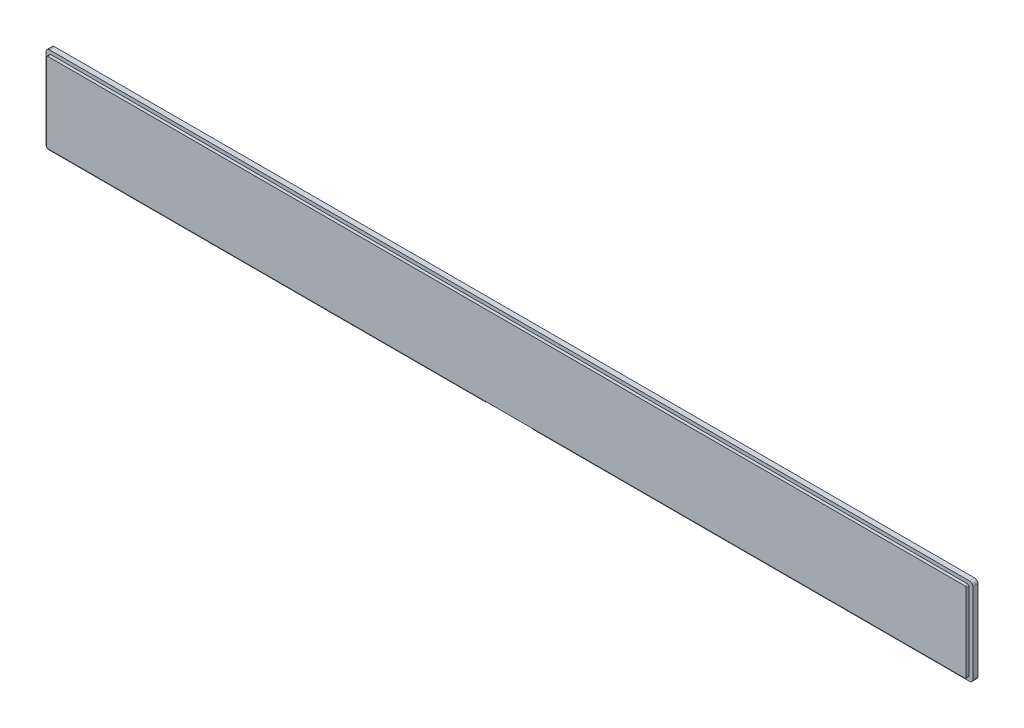
ISO-10303-21;
HEADER;
FILE_DESCRIPTION(('STEP AP214'),'2;1');
FILE_NAME('part.step','',(''),(''),'','','');
FILE_SCHEMA(('AUTOMOTIVE_DESIGN { 1 0 10303 214 1 1 1 1 }'));
ENDSEC;
DATA;
#1=APPLICATION_CONTEXT('core data for automotive mechanical design processes');
#2=APPLICATION_PROTOCOL_DEFINITION('international standard','automotive_design',2000,#1);
#3=PRODUCT_CONTEXT('',#1,'mechanical');
#4=PRODUCT('Part','Part','',(#3));
#5=PRODUCT_RELATED_PRODUCT_CATEGORY('part','',(#4));
#6=PRODUCT_DEFINITION_FORMATION('','',#4);
#7=PRODUCT_DEFINITION_CONTEXT('part definition',#1,'design');
#8=PRODUCT_DEFINITION('design','',#6,#7);
#9=PRODUCT_DEFINITION_SHAPE('','',#8);
#10=(LENGTH_UNIT() NAMED_UNIT(*) SI_UNIT(.MILLI.,.METRE.));
#11=(NAMED_UNIT(*) PLANE_ANGLE_UNIT() SI_UNIT($,.RADIAN.));
#12=(NAMED_UNIT(*) SI_UNIT($,.STERADIAN.) SOLID_ANGLE_UNIT());
#13=UNCERTAINTY_MEASURE_WITH_UNIT(LENGTH_MEASURE(1.E-05),#10,'distance_accuracy_value','');
#14=(GEOMETRIC_REPRESENTATION_CONTEXT(3) GLOBAL_UNCERTAINTY_ASSIGNED_CONTEXT((#13)) GLOBAL_UNIT_ASSIGNED_CONTEXT((#10,
#11,#12)) REPRESENTATION_CONTEXT('',''));
#15=CARTESIAN_POINT('',(0.,0.,0.));
#16=DIRECTION('',(0.,0.,1.));
#17=DIRECTION('',(1.,0.,0.));
#18=AXIS2_PLACEMENT_3D('',#15,#16,#17);
#19=CARTESIAN_POINT('',(213.25,-20.,2.4));
#20=DIRECTION('',(0.,1.,0.));
#21=DIRECTION('',(-1.,0.,0.));
#22=AXIS2_PLACEMENT_3D('',#19,#20,#21);
#23=PLANE('',#22);
#24=DIRECTION('',(0.,0.,1.));
#25=VECTOR('',#24,1.);
#26=CARTESIAN_POINT('',(-11.,-20.,0.));
#27=LINE('',#26,#25);
#28=CARTESIAN_POINT('',(-11.,-20.,0.));
#29=VERTEX_POINT('',#28);
#30=CARTESIAN_POINT('',(-11.,-20.,2.4));
#31=VERTEX_POINT('',#30);
#32=EDGE_CURVE('E171',#29,#31,#27,.T.);
#33=ORIENTED_EDGE('',*,*,#32,.T.);
#34=DIRECTION('',(1.,0.,0.));
#35=VECTOR('',#34,1.);
#36=CARTESIAN_POINT('',(213.25,-20.,2.4));
#37=LINE('',#36,#35);
#38=CARTESIAN_POINT('',(-211.75,-20.,2.4));
#39=VERTEX_POINT('',#38);
#40=EDGE_CURVE('E325',#39,#31,#37,.T.);
#41=ORIENTED_EDGE('',*,*,#40,.F.);
#42=DIRECTION('',(0.,0.,-1.));
#43=VECTOR('',#42,1.);
#44=CARTESIAN_POINT('',(-211.75,-20.,2.4));
#45=LINE('',#44,#43);
#46=CARTESIAN_POINT('',(-211.75,-20.,0.));
#47=VERTEX_POINT('',#46);
#48=EDGE_CURVE('E195',#39,#47,#45,.T.);
#49=ORIENTED_EDGE('',*,*,#48,.T.);
#50=DIRECTION('',(1.,0.,0.));
#51=VECTOR('',#50,1.);
#52=CARTESIAN_POINT('',(213.25,-20.,0.));
#53=LINE('',#52,#51);
#54=EDGE_CURVE('E187',#47,#29,#53,.T.);
#55=ORIENTED_EDGE('',*,*,#54,.T.);
#56=EDGE_LOOP('',(#33,#41,#49,#55));
#57=FACE_BOUND('',#56,.T.);
#58=ADVANCED_FACE('F37',(#57),#23,.F.);
#59=CARTESIAN_POINT('',(0.,0.,2.4));
#60=DIRECTION('',(0.,0.,1.));
#61=DIRECTION('',(1.,0.,0.));
#62=AXIS2_PLACEMENT_3D('',#59,#60,#61);
#63=PLANE('',#62);
#64=CARTESIAN_POINT('',(11.,-19.,2.4));
#65=DIRECTION('',(0.,0.,-1.));
#66=DIRECTION('',(-1.,0.,0.));
#67=AXIS2_PLACEMENT_3D('',#64,#65,#66);
#68=CIRCLE('',#67,0.999999999999987);
#69=CARTESIAN_POINT('',(11.,-20.,2.4));
#70=VERTEX_POINT('',#69);
#71=CARTESIAN_POINT('',(10.,-19.,2.4));
#72=VERTEX_POINT('',#71);
#73=EDGE_CURVE('E354',#70,#72,#68,.T.);
#74=ORIENTED_EDGE('',*,*,#73,.F.);
#75=CARTESIAN_POINT('',(211.75,-20.,2.4));
#76=VERTEX_POINT('',#75);
#77=EDGE_CURVE('E324',#70,#76,#37,.T.);
#78=ORIENTED_EDGE('',*,*,#77,.T.);
#79=CARTESIAN_POINT('',(211.75,-18.5,2.4));
#80=DIRECTION('',(0.,0.,1.));
#81=DIRECTION('',(1.,0.,0.));
#82=AXIS2_PLACEMENT_3D('',#79,#80,#81);
#83=CIRCLE('',#82,1.5);
#84=CARTESIAN_POINT('',(213.25,-18.5,2.4));
#85=VERTEX_POINT('',#84);
#86=EDGE_CURVE('E230',#76,#85,#83,.T.);
#87=ORIENTED_EDGE('',*,*,#86,.T.);
#88=DIRECTION('',(0.,1.,0.));
#89=VECTOR('',#88,1.);
#90=CARTESIAN_POINT('',(213.25,-20.,2.4));
#91=LINE('',#90,#89);
#92=CARTESIAN_POINT('',(213.25,18.5,2.4));
#93=VERTEX_POINT('',#92);
#94=EDGE_CURVE('E327',#85,#93,#91,.T.);
#95=ORIENTED_EDGE('',*,*,#94,.T.);
#96=CARTESIAN_POINT('',(211.75,18.5,2.4));
#97=DIRECTION('',(0.,0.,1.));
#98=DIRECTION('',(1.,0.,0.));
#99=AXIS2_PLACEMENT_3D('',#96,#97,#98);
#100=CIRCLE('',#99,1.5);
#101=CARTESIAN_POINT('',(211.75,20.,2.4));
#102=VERTEX_POINT('',#101);
#103=EDGE_CURVE('E228',#93,#102,#100,.T.);
#104=ORIENTED_EDGE('',*,*,#103,.T.);
#105=DIRECTION('',(-1.,0.,0.));
#106=VECTOR('',#105,1.);
#107=CARTESIAN_POINT('',(213.25,20.,2.4));
#108=LINE('',#107,#106);
#109=CARTESIAN_POINT('',(-211.75,20.,2.4));
#110=VERTEX_POINT('',#109);
#111=EDGE_CURVE('E212',#102,#110,#108,.T.);
#112=ORIENTED_EDGE('',*,*,#111,.T.);
#113=CARTESIAN_POINT('',(-211.75,18.5,2.4));
#114=DIRECTION('',(0.,0.,1.));
#115=DIRECTION('',(1.,0.,0.));
#116=AXIS2_PLACEMENT_3D('',#113,#114,#115);
#117=CIRCLE('',#116,1.5);
#118=CARTESIAN_POINT('',(-213.25,18.5,2.4));
#119=VERTEX_POINT('',#118);
#120=EDGE_CURVE('E232',#110,#119,#117,.T.);
#121=ORIENTED_EDGE('',*,*,#120,.T.);
#122=DIRECTION('',(0.,-1.,0.));
#123=VECTOR('',#122,1.);
#124=CARTESIAN_POINT('',(-213.25,-20.,2.4));
#125=LINE('',#124,#123);
#126=CARTESIAN_POINT('',(-213.25,-18.5,2.4));
#127=VERTEX_POINT('',#126);
#128=EDGE_CURVE('E208',#119,#127,#125,.T.);
#129=ORIENTED_EDGE('',*,*,#128,.T.);
#130=CARTESIAN_POINT('',(-211.75,-18.5,2.4));
#131=DIRECTION('',(0.,0.,1.));
#132=DIRECTION('',(1.,0.,0.));
#133=AXIS2_PLACEMENT_3D('',#130,#131,#132);
#134=CIRCLE('',#133,1.5);
#135=EDGE_CURVE('E234',#127,#39,#134,.T.);
#136=ORIENTED_EDGE('',*,*,#135,.T.);
#137=ORIENTED_EDGE('',*,*,#40,.T.);
#138=CARTESIAN_POINT('',(-11.,-19.,2.4));
#139=DIRECTION('',(0.,0.,-1.));
#140=DIRECTION('',(1.,0.,0.));
#141=AXIS2_PLACEMENT_3D('',#138,#139,#140);
#142=CIRCLE('',#141,0.999999999999987);
#143=CARTESIAN_POINT('',(-10.,-19.,2.4));
#144=VERTEX_POINT('',#143);
#145=EDGE_CURVE('E174',#144,#31,#142,.T.);
#146=ORIENTED_EDGE('',*,*,#145,.F.);
#147=DIRECTION('',(-1.,0.,0.));
#148=VECTOR('',#147,1.);
#149=CARTESIAN_POINT('',(0.,-19.,2.4));
#150=LINE('',#149,#148);
#151=EDGE_CURVE('E353',#72,#144,#150,.T.);
#152=ORIENTED_EDGE('',*,*,#151,.F.);
#153=EDGE_LOOP('',(#74,#78,#87,#95,#104,#112,#121,#129,#136,#137,#146,#152));
#154=FACE_BOUND('',#153,.T.);
#155=DIRECTION('',(-1.,0.,0.));
#156=VECTOR('',#155,1.);
#157=CARTESIAN_POINT('',(-211.6,18.4,2.4));
#158=LINE('',#157,#156);
#159=CARTESIAN_POINT('',(211.1,18.4,2.4));
#160=VERTEX_POINT('',#159);
#161=CARTESIAN_POINT('',(-211.1,18.4,2.4));
#162=VERTEX_POINT('',#161);
#163=EDGE_CURVE('E317',#160,#162,#158,.T.);
#164=ORIENTED_EDGE('',*,*,#163,.F.);
#165=CARTESIAN_POINT('',(211.1,17.9,2.4));
#166=DIRECTION('',(0.,0.,1.));
#167=DIRECTION('',(1.,0.,0.));
#168=AXIS2_PLACEMENT_3D('',#165,#166,#167);
#169=CIRCLE('',#168,0.5);
#170=CARTESIAN_POINT('',(211.6,17.9,2.4));
#171=VERTEX_POINT('',#170);
#172=EDGE_CURVE('E274',#160,#171,#169,.F.);
#173=ORIENTED_EDGE('',*,*,#172,.T.);
#174=DIRECTION('',(0.,1.,0.));
#175=VECTOR('',#174,1.);
#176=CARTESIAN_POINT('',(211.6,18.4,2.4));
#177=LINE('',#176,#175);
#178=CARTESIAN_POINT('',(211.6,-17.9,2.4));
#179=VERTEX_POINT('',#178);
#180=EDGE_CURVE('E283',#179,#171,#177,.T.);
#181=ORIENTED_EDGE('',*,*,#180,.F.);
#182=CARTESIAN_POINT('',(211.1,-17.9,2.4));
#183=DIRECTION('',(0.,0.,1.));
#184=DIRECTION('',(1.,0.,0.));
#185=AXIS2_PLACEMENT_3D('',#182,#183,#184);
#186=CIRCLE('',#185,0.5);
#187=CARTESIAN_POINT('',(211.1,-18.4,2.4));
#188=VERTEX_POINT('',#187);
#189=EDGE_CURVE('E276',#179,#188,#186,.F.);
#190=ORIENTED_EDGE('',*,*,#189,.T.);
#191=DIRECTION('',(1.,0.,0.));
#192=VECTOR('',#191,1.);
#193=CARTESIAN_POINT('',(-211.6,-18.4,2.4));
#194=LINE('',#193,#192);
#195=CARTESIAN_POINT('',(-211.1,-18.4,2.4));
#196=VERTEX_POINT('',#195);
#197=EDGE_CURVE('E281',#196,#188,#194,.T.);
#198=ORIENTED_EDGE('',*,*,#197,.F.);
#199=CARTESIAN_POINT('',(-211.1,-17.9,2.4));
#200=DIRECTION('',(0.,0.,1.));
#201=DIRECTION('',(1.,0.,0.));
#202=AXIS2_PLACEMENT_3D('',#199,#200,#201);
#203=CIRCLE('',#202,0.5);
#204=CARTESIAN_POINT('',(-211.6,-17.9,2.4));
#205=VERTEX_POINT('',#204);
#206=EDGE_CURVE('E45',#196,#205,#203,.F.);
#207=ORIENTED_EDGE('',*,*,#206,.T.);
#208=DIRECTION('',(0.,-1.,0.));
#209=VECTOR('',#208,1.);
#210=CARTESIAN_POINT('',(-211.6,18.4,2.4));
#211=LINE('',#210,#209);
#212=CARTESIAN_POINT('',(-211.6,17.9,2.4));
#213=VERTEX_POINT('',#212);
#214=EDGE_CURVE('E293',#213,#205,#211,.T.);
#215=ORIENTED_EDGE('',*,*,#214,.F.);
#216=CARTESIAN_POINT('',(-211.1,17.9,2.4));
#217=DIRECTION('',(0.,0.,1.));
#218=DIRECTION('',(1.,0.,0.));
#219=AXIS2_PLACEMENT_3D('',#216,#217,#218);
#220=CIRCLE('',#219,0.5);
#221=EDGE_CURVE('E11',#213,#162,#220,.F.);
#222=ORIENTED_EDGE('',*,*,#221,.T.);
#223=EDGE_LOOP('',(#164,#173,#181,#190,#198,#207,#215,#222));
#224=FACE_BOUND('',#223,.T.);
#225=ADVANCED_FACE('F280',(#154,#224),#63,.T.);
#226=CARTESIAN_POINT('',(-213.25,-20.,2.4));
#227=DIRECTION('',(1.,0.,0.));
#228=DIRECTION('',(0.,0.,-1.));
#229=AXIS2_PLACEMENT_3D('',#226,#227,#228);
#230=PLANE('',#229);
#231=DIRECTION('',(0.,-1.,0.));
#232=VECTOR('',#231,1.);
#233=CARTESIAN_POINT('',(-213.25,-20.,0.));
#234=LINE('',#233,#232);
#235=CARTESIAN_POINT('',(-213.25,18.5,0.));
#236=VERTEX_POINT('',#235);
#237=CARTESIAN_POINT('',(-213.25,-18.5,0.));
#238=VERTEX_POINT('',#237);
#239=EDGE_CURVE('E202',#236,#238,#234,.T.);
#240=ORIENTED_EDGE('',*,*,#239,.T.);
#241=DIRECTION('',(0.,0.,-1.));
#242=VECTOR('',#241,1.);
#243=CARTESIAN_POINT('',(-213.25,-18.5,2.4));
#244=LINE('',#243,#242);
#245=EDGE_CURVE('E226',#238,#127,#244,.F.);
#246=ORIENTED_EDGE('',*,*,#245,.T.);
#247=ORIENTED_EDGE('',*,*,#128,.F.);
#248=DIRECTION('',(0.,0.,-1.));
#249=VECTOR('',#248,1.);
#250=CARTESIAN_POINT('',(-213.25,18.5,2.4));
#251=LINE('',#250,#249);
#252=EDGE_CURVE('E223',#119,#236,#251,.T.);
#253=ORIENTED_EDGE('',*,*,#252,.T.);
#254=EDGE_LOOP('',(#240,#246,#247,#253));
#255=FACE_BOUND('',#254,.T.);
#256=ADVANCED_FACE('F345',(#255),#230,.F.);
#257=ORIENTED_EDGE('',*,*,#77,.F.);
#258=DIRECTION('',(0.,0.,1.));
#259=VECTOR('',#258,1.);
#260=CARTESIAN_POINT('',(11.,-20.,0.));
#261=LINE('',#260,#259);
#262=CARTESIAN_POINT('',(11.,-20.,0.));
#263=VERTEX_POINT('',#262);
#264=EDGE_CURVE('E179',#263,#70,#261,.T.);
#265=ORIENTED_EDGE('',*,*,#264,.F.);
#266=CARTESIAN_POINT('',(211.75,-20.,0.));
#267=VERTEX_POINT('',#266);
#268=EDGE_CURVE('E197',#263,#267,#53,.T.);
#269=ORIENTED_EDGE('',*,*,#268,.T.);
#270=DIRECTION('',(0.,0.,-1.));
#271=VECTOR('',#270,1.);
#272=CARTESIAN_POINT('',(211.75,-20.,2.4));
#273=LINE('',#272,#271);
#274=EDGE_CURVE('E209',#267,#76,#273,.F.);
#275=ORIENTED_EDGE('',*,*,#274,.T.);
#276=EDGE_LOOP('',(#257,#265,#269,#275));
#277=FACE_BOUND('',#276,.T.);
#278=ADVANCED_FACE('F367',(#277),#23,.F.);
#279=CARTESIAN_POINT('',(213.25,-20.,2.4));
#280=DIRECTION('',(-1.,0.,0.));
#281=DIRECTION('',(0.,0.,1.));
#282=AXIS2_PLACEMENT_3D('',#279,#280,#281);
#283=PLANE('',#282);
#284=ORIENTED_EDGE('',*,*,#94,.F.);
#285=DIRECTION('',(0.,0.,-1.));
#286=VECTOR('',#285,1.);
#287=CARTESIAN_POINT('',(213.25,-18.5,2.4));
#288=LINE('',#287,#286);
#289=CARTESIAN_POINT('',(213.25,-18.5,0.));
#290=VERTEX_POINT('',#289);
#291=EDGE_CURVE('E243',#85,#290,#288,.T.);
#292=ORIENTED_EDGE('',*,*,#291,.T.);
#293=DIRECTION('',(0.,1.,0.));
#294=VECTOR('',#293,1.);
#295=CARTESIAN_POINT('',(213.25,-20.,0.));
#296=LINE('',#295,#294);
#297=CARTESIAN_POINT('',(213.25,18.5,0.));
#298=VERTEX_POINT('',#297);
#299=EDGE_CURVE('E196',#290,#298,#296,.T.);
#300=ORIENTED_EDGE('',*,*,#299,.T.);
#301=DIRECTION('',(0.,0.,-1.));
#302=VECTOR('',#301,1.);
#303=CARTESIAN_POINT('',(213.25,18.5,2.4));
#304=LINE('',#303,#302);
#305=EDGE_CURVE('E241',#298,#93,#304,.F.);
#306=ORIENTED_EDGE('',*,*,#305,.T.);
#307=EDGE_LOOP('',(#284,#292,#300,#306));
#308=FACE_BOUND('',#307,.T.);
#309=ADVANCED_FACE('F375',(#308),#283,.F.);
#310=CARTESIAN_POINT('',(213.25,20.,2.4));
#311=DIRECTION('',(0.,-1.,0.));
#312=DIRECTION('',(1.,0.,0.));
#313=AXIS2_PLACEMENT_3D('',#310,#311,#312);
#314=PLANE('',#313);
#315=DIRECTION('',(-1.,0.,0.));
#316=VECTOR('',#315,1.);
#317=CARTESIAN_POINT('',(213.25,20.,0.));
#318=LINE('',#317,#316);
#319=CARTESIAN_POINT('',(211.75,20.,0.));
#320=VERTEX_POINT('',#319);
#321=CARTESIAN_POINT('',(-211.75,20.,0.));
#322=VERTEX_POINT('',#321);
#323=EDGE_CURVE('E200',#320,#322,#318,.T.);
#324=ORIENTED_EDGE('',*,*,#323,.T.);
#325=DIRECTION('',(0.,0.,-1.));
#326=VECTOR('',#325,1.);
#327=CARTESIAN_POINT('',(-211.75,20.,2.4));
#328=LINE('',#327,#326);
#329=EDGE_CURVE('E239',#322,#110,#328,.F.);
#330=ORIENTED_EDGE('',*,*,#329,.T.);
#331=ORIENTED_EDGE('',*,*,#111,.F.);
#332=DIRECTION('',(0.,0.,-1.));
#333=VECTOR('',#332,1.);
#334=CARTESIAN_POINT('',(211.75,20.,2.4));
#335=LINE('',#334,#333);
#336=EDGE_CURVE('E236',#102,#320,#335,.T.);
#337=ORIENTED_EDGE('',*,*,#336,.T.);
#338=EDGE_LOOP('',(#324,#330,#331,#337));
#339=FACE_BOUND('',#338,.T.);
#340=ADVANCED_FACE('F380',(#339),#314,.F.);
#341=CARTESIAN_POINT('',(0.,0.,0.));
#342=DIRECTION('',(0.,0.,1.));
#343=DIRECTION('',(1.,0.,0.));
#344=AXIS2_PLACEMENT_3D('',#341,#342,#343);
#345=PLANE('',#344);
#346=ORIENTED_EDGE('',*,*,#268,.F.);
#347=CARTESIAN_POINT('',(11.,-19.,0.));
#348=DIRECTION('',(0.,0.,-1.));
#349=DIRECTION('',(-1.,0.,0.));
#350=AXIS2_PLACEMENT_3D('',#347,#348,#349);
#351=CIRCLE('',#350,0.999999999999987);
#352=CARTESIAN_POINT('',(10.,-19.,0.));
#353=VERTEX_POINT('',#352);
#354=EDGE_CURVE('E191',#263,#353,#351,.T.);
#355=ORIENTED_EDGE('',*,*,#354,.T.);
#356=DIRECTION('',(-1.,0.,0.));
#357=VECTOR('',#356,1.);
#358=CARTESIAN_POINT('',(0.,-19.,0.));
#359=LINE('',#358,#357);
#360=CARTESIAN_POINT('',(-10.,-19.,0.));
#361=VERTEX_POINT('',#360);
#362=EDGE_CURVE('E190',#353,#361,#359,.T.);
#363=ORIENTED_EDGE('',*,*,#362,.T.);
#364=CARTESIAN_POINT('',(-11.,-19.,0.));
#365=DIRECTION('',(0.,0.,-1.));
#366=DIRECTION('',(1.,0.,0.));
#367=AXIS2_PLACEMENT_3D('',#364,#365,#366);
#368=CIRCLE('',#367,0.999999999999987);
#369=EDGE_CURVE('E52',#361,#29,#368,.T.);
#370=ORIENTED_EDGE('',*,*,#369,.T.);
#371=ORIENTED_EDGE('',*,*,#54,.F.);
#372=CARTESIAN_POINT('',(-211.75,-18.5,0.));
#373=DIRECTION('',(0.,0.,1.));
#374=DIRECTION('',(1.,0.,0.));
#375=AXIS2_PLACEMENT_3D('',#372,#373,#374);
#376=CIRCLE('',#375,1.5);
#377=EDGE_CURVE('E221',#47,#238,#376,.F.);
#378=ORIENTED_EDGE('',*,*,#377,.T.);
#379=ORIENTED_EDGE('',*,*,#239,.F.);
#380=CARTESIAN_POINT('',(-211.75,18.5,0.));
#381=DIRECTION('',(0.,0.,1.));
#382=DIRECTION('',(1.,0.,0.));
#383=AXIS2_PLACEMENT_3D('',#380,#381,#382);
#384=CIRCLE('',#383,1.5);
#385=EDGE_CURVE('E219',#236,#322,#384,.F.);
#386=ORIENTED_EDGE('',*,*,#385,.T.);
#387=ORIENTED_EDGE('',*,*,#323,.F.);
#388=CARTESIAN_POINT('',(211.75,18.5,0.));
#389=DIRECTION('',(0.,0.,1.));
#390=DIRECTION('',(1.,0.,0.));
#391=AXIS2_PLACEMENT_3D('',#388,#389,#390);
#392=CIRCLE('',#391,1.5);
#393=EDGE_CURVE('E214',#320,#298,#392,.F.);
#394=ORIENTED_EDGE('',*,*,#393,.T.);
#395=ORIENTED_EDGE('',*,*,#299,.F.);
#396=CARTESIAN_POINT('',(211.75,-18.5,0.));
#397=DIRECTION('',(0.,0.,1.));
#398=DIRECTION('',(1.,0.,0.));
#399=AXIS2_PLACEMENT_3D('',#396,#397,#398);
#400=CIRCLE('',#399,1.5);
#401=EDGE_CURVE('E216',#290,#267,#400,.F.);
#402=ORIENTED_EDGE('',*,*,#401,.T.);
#403=EDGE_LOOP('',(#346,#355,#363,#370,#371,#378,#379,#386,#387,#394,#395,#402));
#404=FACE_BOUND('',#403,.T.);
#405=ADVANCED_FACE('F186',(#404),#345,.F.);
#406=CARTESIAN_POINT('',(211.6,18.4,3.8));
#407=DIRECTION('',(-1.,0.,0.));
#408=DIRECTION('',(0.,0.,1.));
#409=AXIS2_PLACEMENT_3D('',#406,#407,#408);
#410=PLANE('',#409);
#411=ORIENTED_EDGE('',*,*,#180,.T.);
#412=DIRECTION('',(0.,0.,-1.));
#413=VECTOR('',#412,1.);
#414=CARTESIAN_POINT('',(211.6,17.9,3.8));
#415=LINE('',#414,#413);
#416=CARTESIAN_POINT('',(211.6,17.9,3.8));
#417=VERTEX_POINT('',#416);
#418=EDGE_CURVE('E254',#171,#417,#415,.F.);
#419=ORIENTED_EDGE('',*,*,#418,.T.);
#420=DIRECTION('',(0.,1.,0.));
#421=VECTOR('',#420,1.);
#422=CARTESIAN_POINT('',(211.6,18.4,3.8));
#423=LINE('',#422,#421);
#424=CARTESIAN_POINT('',(211.6,-17.9,3.8));
#425=VERTEX_POINT('',#424);
#426=EDGE_CURVE('E292',#425,#417,#423,.T.);
#427=ORIENTED_EDGE('',*,*,#426,.F.);
#428=DIRECTION('',(0.,0.,-1.));
#429=VECTOR('',#428,1.);
#430=CARTESIAN_POINT('',(211.6,-17.9,3.8));
#431=LINE('',#430,#429);
#432=EDGE_CURVE('E251',#425,#179,#431,.T.);
#433=ORIENTED_EDGE('',*,*,#432,.T.);
#434=EDGE_LOOP('',(#411,#419,#427,#433));
#435=FACE_BOUND('',#434,.T.);
#436=ADVANCED_FACE('F304',(#435),#410,.F.);
#437=CARTESIAN_POINT('',(-211.6,18.4,3.8));
#438=DIRECTION('',(0.,-1.,0.));
#439=DIRECTION('',(0.,0.,-1.));
#440=AXIS2_PLACEMENT_3D('',#437,#438,#439);
#441=PLANE('',#440);
#442=DIRECTION('',(-1.,0.,0.));
#443=VECTOR('',#442,1.);
#444=CARTESIAN_POINT('',(-211.6,18.4,3.8));
#445=LINE('',#444,#443);
#446=CARTESIAN_POINT('',(211.1,18.4,3.8));
#447=VERTEX_POINT('',#446);
#448=CARTESIAN_POINT('',(-211.1,18.4,3.8));
#449=VERTEX_POINT('',#448);
#450=EDGE_CURVE('E306',#447,#449,#445,.T.);
#451=ORIENTED_EDGE('',*,*,#450,.F.);
#452=DIRECTION('',(0.,0.,-1.));
#453=VECTOR('',#452,1.);
#454=CARTESIAN_POINT('',(211.1,18.4,3.8));
#455=LINE('',#454,#453);
#456=EDGE_CURVE('E248',#447,#160,#455,.T.);
#457=ORIENTED_EDGE('',*,*,#456,.T.);
#458=ORIENTED_EDGE('',*,*,#163,.T.);
#459=DIRECTION('',(0.,0.,-1.));
#460=VECTOR('',#459,1.);
#461=CARTESIAN_POINT('',(-211.1,18.4,3.8));
#462=LINE('',#461,#460);
#463=EDGE_CURVE('E246',#162,#449,#462,.F.);
#464=ORIENTED_EDGE('',*,*,#463,.T.);
#465=EDGE_LOOP('',(#451,#457,#458,#464));
#466=FACE_BOUND('',#465,.T.);
#467=ADVANCED_FACE('F437',(#466),#441,.F.);
#468=CARTESIAN_POINT('',(-211.6,18.4,3.8));
#469=DIRECTION('',(1.,0.,0.));
#470=DIRECTION('',(0.,0.,-1.));
#471=AXIS2_PLACEMENT_3D('',#468,#469,#470);
#472=PLANE('',#471);
#473=ORIENTED_EDGE('',*,*,#214,.T.);
#474=DIRECTION('',(0.,0.,-1.));
#475=VECTOR('',#474,1.);
#476=CARTESIAN_POINT('',(-211.6,-17.9,3.8));
#477=LINE('',#476,#475);
#478=CARTESIAN_POINT('',(-211.6,-17.9,3.8));
#479=VERTEX_POINT('',#478);
#480=EDGE_CURVE('E272',#205,#479,#477,.F.);
#481=ORIENTED_EDGE('',*,*,#480,.T.);
#482=DIRECTION('',(0.,-1.,0.));
#483=VECTOR('',#482,1.);
#484=CARTESIAN_POINT('',(-211.6,18.4,3.8));
#485=LINE('',#484,#483);
#486=CARTESIAN_POINT('',(-211.6,17.9,3.8));
#487=VERTEX_POINT('',#486);
#488=EDGE_CURVE('E309',#487,#479,#485,.T.);
#489=ORIENTED_EDGE('',*,*,#488,.F.);
#490=DIRECTION('',(0.,0.,-1.));
#491=VECTOR('',#490,1.);
#492=CARTESIAN_POINT('',(-211.6,17.9,3.8));
#493=LINE('',#492,#491);
#494=EDGE_CURVE('E269',#487,#213,#493,.T.);
#495=ORIENTED_EDGE('',*,*,#494,.T.);
#496=EDGE_LOOP('',(#473,#481,#489,#495));
#497=FACE_BOUND('',#496,.T.);
#498=ADVANCED_FACE('F433',(#497),#472,.F.);
#499=CARTESIAN_POINT('',(-211.6,-18.4,3.8));
#500=DIRECTION('',(0.,1.,0.));
#501=DIRECTION('',(0.,0.,1.));
#502=AXIS2_PLACEMENT_3D('',#499,#500,#501);
#503=PLANE('',#502);
#504=ORIENTED_EDGE('',*,*,#197,.T.);
#505=DIRECTION('',(0.,0.,-1.));
#506=VECTOR('',#505,1.);
#507=CARTESIAN_POINT('',(211.1,-18.4,3.8));
#508=LINE('',#507,#506);
#509=CARTESIAN_POINT('',(211.1,-18.4,3.8));
#510=VERTEX_POINT('',#509);
#511=EDGE_CURVE('E267',#188,#510,#508,.F.);
#512=ORIENTED_EDGE('',*,*,#511,.T.);
#513=DIRECTION('',(1.,0.,0.));
#514=VECTOR('',#513,1.);
#515=CARTESIAN_POINT('',(-211.6,-18.4,3.8));
#516=LINE('',#515,#514);
#517=CARTESIAN_POINT('',(-211.1,-18.4,3.8));
#518=VERTEX_POINT('',#517);
#519=EDGE_CURVE('E302',#518,#510,#516,.T.);
#520=ORIENTED_EDGE('',*,*,#519,.F.);
#521=DIRECTION('',(0.,0.,-1.));
#522=VECTOR('',#521,1.);
#523=CARTESIAN_POINT('',(-211.1,-18.4,3.8));
#524=LINE('',#523,#522);
#525=EDGE_CURVE('E264',#518,#196,#524,.T.);
#526=ORIENTED_EDGE('',*,*,#525,.T.);
#527=EDGE_LOOP('',(#504,#512,#520,#526));
#528=FACE_BOUND('',#527,.T.);
#529=ADVANCED_FACE('F288',(#528),#503,.F.);
#530=CARTESIAN_POINT('',(0.,0.,3.8));
#531=DIRECTION('',(0.,0.,1.));
#532=DIRECTION('',(1.,0.,0.));
#533=AXIS2_PLACEMENT_3D('',#530,#531,#532);
#534=PLANE('',#533);
#535=ORIENTED_EDGE('',*,*,#426,.T.);
#536=CARTESIAN_POINT('',(211.1,17.9,3.8));
#537=DIRECTION('',(0.,0.,1.));
#538=DIRECTION('',(1.,0.,0.));
#539=AXIS2_PLACEMENT_3D('',#536,#537,#538);
#540=CIRCLE('',#539,0.5);
#541=EDGE_CURVE('E262',#417,#447,#540,.T.);
#542=ORIENTED_EDGE('',*,*,#541,.T.);
#543=ORIENTED_EDGE('',*,*,#450,.T.);
#544=CARTESIAN_POINT('',(-211.1,17.9,3.8));
#545=DIRECTION('',(0.,0.,1.));
#546=DIRECTION('',(1.,0.,0.));
#547=AXIS2_PLACEMENT_3D('',#544,#545,#546);
#548=CIRCLE('',#547,0.5);
#549=EDGE_CURVE('E256',#449,#487,#548,.T.);
#550=ORIENTED_EDGE('',*,*,#549,.T.);
#551=ORIENTED_EDGE('',*,*,#488,.T.);
#552=CARTESIAN_POINT('',(-211.1,-17.9,3.8));
#553=DIRECTION('',(0.,0.,1.));
#554=DIRECTION('',(1.,0.,0.));
#555=AXIS2_PLACEMENT_3D('',#552,#553,#554);
#556=CIRCLE('',#555,0.5);
#557=EDGE_CURVE('E258',#479,#518,#556,.T.);
#558=ORIENTED_EDGE('',*,*,#557,.T.);
#559=ORIENTED_EDGE('',*,*,#519,.T.);
#560=CARTESIAN_POINT('',(211.1,-17.9,3.8));
#561=DIRECTION('',(0.,0.,1.));
#562=DIRECTION('',(1.,0.,0.));
#563=AXIS2_PLACEMENT_3D('',#560,#561,#562);
#564=CIRCLE('',#563,0.5);
#565=EDGE_CURVE('E260',#510,#425,#564,.T.);
#566=ORIENTED_EDGE('',*,*,#565,.T.);
#567=EDGE_LOOP('',(#535,#542,#543,#550,#551,#558,#559,#566));
#568=FACE_BOUND('',#567,.T.);
#569=ADVANCED_FACE('F300',(#568),#534,.T.);
#570=CARTESIAN_POINT('',(-211.75,-18.5,2.4));
#571=DIRECTION('',(0.,0.,-1.));
#572=DIRECTION('',(-1.,0.,0.));
#573=AXIS2_PLACEMENT_3D('',#570,#571,#572);
#574=CYLINDRICAL_SURFACE('',#573,1.5);
#575=ORIENTED_EDGE('',*,*,#135,.F.);
#576=ORIENTED_EDGE('',*,*,#245,.F.);
#577=ORIENTED_EDGE('',*,*,#377,.F.);
#578=ORIENTED_EDGE('',*,*,#48,.F.);
#579=EDGE_LOOP('',(#575,#576,#577,#578));
#580=FACE_BOUND('',#579,.T.);
#581=ADVANCED_FACE('F350',(#580),#574,.T.);
#582=CARTESIAN_POINT('',(-211.75,18.5,2.4));
#583=DIRECTION('',(0.,0.,-1.));
#584=DIRECTION('',(-1.,0.,0.));
#585=AXIS2_PLACEMENT_3D('',#582,#583,#584);
#586=CYLINDRICAL_SURFACE('',#585,1.5);
#587=ORIENTED_EDGE('',*,*,#120,.F.);
#588=ORIENTED_EDGE('',*,*,#329,.F.);
#589=ORIENTED_EDGE('',*,*,#385,.F.);
#590=ORIENTED_EDGE('',*,*,#252,.F.);
#591=EDGE_LOOP('',(#587,#588,#589,#590));
#592=FACE_BOUND('',#591,.T.);
#593=ADVANCED_FACE('F341',(#592),#586,.T.);
#594=CARTESIAN_POINT('',(211.75,-18.5,2.4));
#595=DIRECTION('',(0.,0.,-1.));
#596=DIRECTION('',(-1.,0.,0.));
#597=AXIS2_PLACEMENT_3D('',#594,#595,#596);
#598=CYLINDRICAL_SURFACE('',#597,1.5);
#599=ORIENTED_EDGE('',*,*,#86,.F.);
#600=ORIENTED_EDGE('',*,*,#274,.F.);
#601=ORIENTED_EDGE('',*,*,#401,.F.);
#602=ORIENTED_EDGE('',*,*,#291,.F.);
#603=EDGE_LOOP('',(#599,#600,#601,#602));
#604=FACE_BOUND('',#603,.T.);
#605=ADVANCED_FACE('F372',(#604),#598,.T.);
#606=CARTESIAN_POINT('',(211.75,18.5,2.4));
#607=DIRECTION('',(0.,0.,-1.));
#608=DIRECTION('',(-1.,0.,0.));
#609=AXIS2_PLACEMENT_3D('',#606,#607,#608);
#610=CYLINDRICAL_SURFACE('',#609,1.5);
#611=ORIENTED_EDGE('',*,*,#103,.F.);
#612=ORIENTED_EDGE('',*,*,#305,.F.);
#613=ORIENTED_EDGE('',*,*,#393,.F.);
#614=ORIENTED_EDGE('',*,*,#336,.F.);
#615=EDGE_LOOP('',(#611,#612,#613,#614));
#616=FACE_BOUND('',#615,.T.);
#617=ADVANCED_FACE('F379',(#616),#610,.T.);
#618=CARTESIAN_POINT('',(211.1,17.9,3.8));
#619=DIRECTION('',(0.,0.,-1.));
#620=DIRECTION('',(-1.,0.,0.));
#621=AXIS2_PLACEMENT_3D('',#618,#619,#620);
#622=CYLINDRICAL_SURFACE('',#621,0.5);
#623=ORIENTED_EDGE('',*,*,#541,.F.);
#624=ORIENTED_EDGE('',*,*,#418,.F.);
#625=ORIENTED_EDGE('',*,*,#172,.F.);
#626=ORIENTED_EDGE('',*,*,#456,.F.);
#627=EDGE_LOOP('',(#623,#624,#625,#626));
#628=FACE_BOUND('',#627,.T.);
#629=ADVANCED_FACE('F415',(#628),#622,.T.);
#630=CARTESIAN_POINT('',(211.1,-17.9,3.8));
#631=DIRECTION('',(0.,0.,-1.));
#632=DIRECTION('',(-1.,0.,0.));
#633=AXIS2_PLACEMENT_3D('',#630,#631,#632);
#634=CYLINDRICAL_SURFACE('',#633,0.5);
#635=ORIENTED_EDGE('',*,*,#565,.F.);
#636=ORIENTED_EDGE('',*,*,#511,.F.);
#637=ORIENTED_EDGE('',*,*,#189,.F.);
#638=ORIENTED_EDGE('',*,*,#432,.F.);
#639=EDGE_LOOP('',(#635,#636,#637,#638));
#640=FACE_BOUND('',#639,.T.);
#641=ADVANCED_FACE('F296',(#640),#634,.T.);
#642=CARTESIAN_POINT('',(-211.1,-17.9,3.8));
#643=DIRECTION('',(0.,0.,-1.));
#644=DIRECTION('',(-1.,0.,0.));
#645=AXIS2_PLACEMENT_3D('',#642,#643,#644);
#646=CYLINDRICAL_SURFACE('',#645,0.5);
#647=ORIENTED_EDGE('',*,*,#557,.F.);
#648=ORIENTED_EDGE('',*,*,#480,.F.);
#649=ORIENTED_EDGE('',*,*,#206,.F.);
#650=ORIENTED_EDGE('',*,*,#525,.F.);
#651=EDGE_LOOP('',(#647,#648,#649,#650));
#652=FACE_BOUND('',#651,.T.);
#653=ADVANCED_FACE('F420',(#652),#646,.T.);
#654=CARTESIAN_POINT('',(-211.1,17.9,3.8));
#655=DIRECTION('',(0.,0.,-1.));
#656=DIRECTION('',(-1.,0.,0.));
#657=AXIS2_PLACEMENT_3D('',#654,#655,#656);
#658=CYLINDRICAL_SURFACE('',#657,0.5);
#659=ORIENTED_EDGE('',*,*,#549,.F.);
#660=ORIENTED_EDGE('',*,*,#463,.F.);
#661=ORIENTED_EDGE('',*,*,#221,.F.);
#662=ORIENTED_EDGE('',*,*,#494,.F.);
#663=EDGE_LOOP('',(#659,#660,#661,#662));
#664=FACE_BOUND('',#663,.T.);
#665=ADVANCED_FACE('F39',(#664),#658,.T.);
#666=CARTESIAN_POINT('',(11.,-19.,0.));
#667=DIRECTION('',(0.,0.,1.));
#668=DIRECTION('',(1.,0.,0.));
#669=AXIS2_PLACEMENT_3D('',#666,#667,#668);
#670=CYLINDRICAL_SURFACE('',#669,0.999999999999987);
#671=ORIENTED_EDGE('',*,*,#73,.T.);
#672=DIRECTION('',(0.,0.,1.));
#673=VECTOR('',#672,1.);
#674=CARTESIAN_POINT('',(10.,-19.,0.));
#675=LINE('',#674,#673);
#676=EDGE_CURVE('E318',#353,#72,#675,.T.);
#677=ORIENTED_EDGE('',*,*,#676,.F.);
#678=ORIENTED_EDGE('',*,*,#354,.F.);
#679=ORIENTED_EDGE('',*,*,#264,.T.);
#680=EDGE_LOOP('',(#671,#677,#678,#679));
#681=FACE_BOUND('',#680,.T.);
#682=ADVANCED_FACE('F364',(#681),#670,.T.);
#683=CARTESIAN_POINT('',(-11.,-19.,0.));
#684=DIRECTION('',(0.,0.,1.));
#685=DIRECTION('',(1.,0.,0.));
#686=AXIS2_PLACEMENT_3D('',#683,#684,#685);
#687=CYLINDRICAL_SURFACE('',#686,0.999999999999987);
#688=ORIENTED_EDGE('',*,*,#145,.T.);
#689=ORIENTED_EDGE('',*,*,#32,.F.);
#690=ORIENTED_EDGE('',*,*,#369,.F.);
#691=DIRECTION('',(0.,0.,1.));
#692=VECTOR('',#691,1.);
#693=CARTESIAN_POINT('',(-10.,-19.,0.));
#694=LINE('',#693,#692);
#695=EDGE_CURVE('E180',#361,#144,#694,.T.);
#696=ORIENTED_EDGE('',*,*,#695,.T.);
#697=EDGE_LOOP('',(#688,#689,#690,#696));
#698=FACE_BOUND('',#697,.T.);
#699=ADVANCED_FACE('F172',(#698),#687,.T.);
#700=CARTESIAN_POINT('',(0.,-19.,0.));
#701=DIRECTION('',(0.,1.,0.));
#702=DIRECTION('',(0.,0.,1.));
#703=AXIS2_PLACEMENT_3D('',#700,#701,#702);
#704=PLANE('',#703);
#705=ORIENTED_EDGE('',*,*,#151,.T.);
#706=ORIENTED_EDGE('',*,*,#695,.F.);
#707=ORIENTED_EDGE('',*,*,#362,.F.);
#708=ORIENTED_EDGE('',*,*,#676,.T.);
#709=EDGE_LOOP('',(#705,#706,#707,#708));
#710=FACE_BOUND('',#709,.T.);
#711=ADVANCED_FACE('F383',(#710),#704,.F.);
#712=CLOSED_SHELL('',(#58,#225,#256,#278,#309,#340,#405,#436,#467,#498,#529,#569,#581,#593,#605,
#617,#629,#641,#653,#665,#682,#699,#711));
#713=MANIFOLD_SOLID_BREP('B2',#712);
#714=ADVANCED_BREP_SHAPE_REPRESENTATION('',(#18,#713),#14);
#715=SHAPE_DEFINITION_REPRESENTATION(#9,#714);
ENDSEC;
END-ISO-10303-21;
